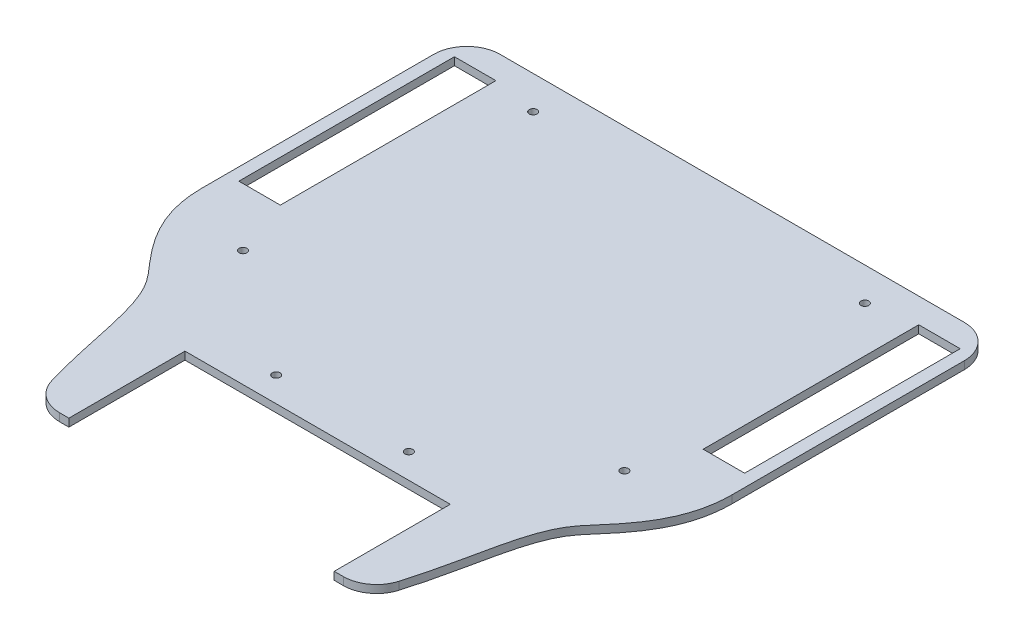
ISO-10303-21;
HEADER;
FILE_DESCRIPTION(('STEP AP214'),'2;1');
FILE_NAME('part.step','',(''),(''),'','','');
FILE_SCHEMA(('AUTOMOTIVE_DESIGN { 1 0 10303 214 1 1 1 1 }'));
ENDSEC;
DATA;
#1=APPLICATION_CONTEXT('core data for automotive mechanical design processes');
#2=APPLICATION_PROTOCOL_DEFINITION('international standard','automotive_design',2000,#1);
#3=PRODUCT_CONTEXT('',#1,'mechanical');
#4=PRODUCT('Part','Part','',(#3));
#5=PRODUCT_RELATED_PRODUCT_CATEGORY('part','',(#4));
#6=PRODUCT_DEFINITION_FORMATION('','',#4);
#7=PRODUCT_DEFINITION_CONTEXT('part definition',#1,'design');
#8=PRODUCT_DEFINITION('design','',#6,#7);
#9=PRODUCT_DEFINITION_SHAPE('','',#8);
#10=(LENGTH_UNIT() NAMED_UNIT(*) SI_UNIT(.MILLI.,.METRE.));
#11=(NAMED_UNIT(*) PLANE_ANGLE_UNIT() SI_UNIT($,.RADIAN.));
#12=(NAMED_UNIT(*) SI_UNIT($,.STERADIAN.) SOLID_ANGLE_UNIT());
#13=UNCERTAINTY_MEASURE_WITH_UNIT(LENGTH_MEASURE(1.E-05),#10,'distance_accuracy_value','');
#14=(GEOMETRIC_REPRESENTATION_CONTEXT(3) GLOBAL_UNCERTAINTY_ASSIGNED_CONTEXT((#13)) GLOBAL_UNIT_ASSIGNED_CONTEXT((#10,
#11,#12)) REPRESENTATION_CONTEXT('',''));
#15=CARTESIAN_POINT('',(0.,0.,0.));
#16=DIRECTION('',(0.,0.,1.));
#17=DIRECTION('',(1.,0.,0.));
#18=AXIS2_PLACEMENT_3D('',#15,#16,#17);
#19=CARTESIAN_POINT('',(-101.6,1.5,0.));
#20=CARTESIAN_POINT('',(-101.6,1.5,15.24));
#21=CARTESIAN_POINT('',(-92.8363642067102,1.5,28.2576559748796));
#22=CARTESIAN_POINT('',(-72.9170512750052,1.5,49.8798957879859));
#23=CARTESIAN_POINT('',(-72.6216772224956,1.5,76.5383978036396));
#24=CARTESIAN_POINT('',(-63.5,1.5,101.6));
#25=B_SPLINE_CURVE_WITH_KNOTS('',3,(#19,#20,#21,#22,#23,#24),.UNSPECIFIED.,.F.,.F.,(4,1,1,4),
(0.,0.41538000283183,0.51538000283183,1.),.UNSPECIFIED.);
#26=DIRECTION('',(0.,-1.,0.));
#27=VECTOR('',#26,1.);
#28=SURFACE_OF_LINEAR_EXTRUSION('',#25,#27);
#29=CARTESIAN_POINT('',(-101.6,-1.5,0.));
#30=CARTESIAN_POINT('',(-101.6,-1.5,15.24));
#31=CARTESIAN_POINT('',(-92.8363642067102,-1.5,28.2576559748796));
#32=CARTESIAN_POINT('',(-72.9170512750052,-1.5,49.8798957879859));
#33=CARTESIAN_POINT('',(-72.6216772224956,-1.5,76.5383978036396));
#34=CARTESIAN_POINT('',(-63.5,-1.5,101.6));
#35=B_SPLINE_CURVE_WITH_KNOTS('',3,(#29,#30,#31,#32,#33,#34),.UNSPECIFIED.,.F.,.F.,(4,1,1,4),
(0.,0.41538000283183,0.51538000283183,1.),.UNSPECIFIED.);
#36=CARTESIAN_POINT('',(-101.6,-1.5,0.));
#37=VERTEX_POINT('',#36);
#38=CARTESIAN_POINT('',(-66.4896873195006,-1.5,92.5138243337678));
#39=VERTEX_POINT('',#38);
#40=EDGE_CURVE('E228',#37,#39,#35,.T.);
#41=ORIENTED_EDGE('',*,*,#40,.T.);
#42=DIRECTION('',(0.,-1.,0.));
#43=VECTOR('',#42,1.);
#44=CARTESIAN_POINT('',(-66.4896873195006,-1.5,92.5138243337678));
#45=LINE('',#44,#43);
#46=CARTESIAN_POINT('',(-66.4896873195006,1.5,92.5138243337678));
#47=VERTEX_POINT('',#46);
#48=EDGE_CURVE('E349',#39,#47,#45,.F.);
#49=ORIENTED_EDGE('',*,*,#48,.T.);
#50=CARTESIAN_POINT('',(-101.6,1.5,0.));
#51=VERTEX_POINT('',#50);
#52=EDGE_CURVE('E299',#51,#47,#25,.T.);
#53=ORIENTED_EDGE('',*,*,#52,.F.);
#54=DIRECTION('',(0.,-1.,0.));
#55=VECTOR('',#54,1.);
#56=CARTESIAN_POINT('',(-101.6,1.5,0.));
#57=LINE('',#56,#55);
#58=EDGE_CURVE('E444',#51,#37,#57,.T.);
#59=ORIENTED_EDGE('',*,*,#58,.T.);
#60=EDGE_LOOP('',(#41,#49,#53,#59));
#61=FACE_BOUND('',#60,.T.);
#62=ADVANCED_FACE('F37',(#61),#28,.F.);
#63=CARTESIAN_POINT('',(-63.5,1.5,101.6));
#64=DIRECTION('',(0.,0.,-1.));
#65=DIRECTION('',(-1.,0.,0.));
#66=AXIS2_PLACEMENT_3D('',#63,#64,#65);
#67=PLANE('',#66);
#68=DIRECTION('',(1.,0.,0.));
#69=VECTOR('',#68,1.);
#70=CARTESIAN_POINT('',(-63.5,1.5,101.6));
#71=LINE('',#70,#69);
#72=CARTESIAN_POINT('',(-54.3147017472436,1.5,101.6));
#73=VERTEX_POINT('',#72);
#74=CARTESIAN_POINT('',(-50.8,1.5,101.6));
#75=VERTEX_POINT('',#74);
#76=EDGE_CURVE('E305',#73,#75,#71,.T.);
#77=ORIENTED_EDGE('',*,*,#76,.F.);
#78=DIRECTION('',(0.,-1.,0.));
#79=VECTOR('',#78,1.);
#80=CARTESIAN_POINT('',(-54.3147017472436,1.5,101.6));
#81=LINE('',#80,#79);
#82=CARTESIAN_POINT('',(-54.3147017472436,-1.5,101.6));
#83=VERTEX_POINT('',#82);
#84=EDGE_CURVE('E346',#73,#83,#81,.T.);
#85=ORIENTED_EDGE('',*,*,#84,.T.);
#86=DIRECTION('',(1.,0.,0.));
#87=VECTOR('',#86,1.);
#88=CARTESIAN_POINT('',(-63.5,-1.5,101.6));
#89=LINE('',#88,#87);
#90=CARTESIAN_POINT('',(-50.8,-1.5,101.6));
#91=VERTEX_POINT('',#90);
#92=EDGE_CURVE('E417',#83,#91,#89,.T.);
#93=ORIENTED_EDGE('',*,*,#92,.T.);
#94=DIRECTION('',(0.,-1.,0.));
#95=VECTOR('',#94,1.);
#96=CARTESIAN_POINT('',(-50.8,1.5,101.6));
#97=LINE('',#96,#95);
#98=EDGE_CURVE('E412',#75,#91,#97,.T.);
#99=ORIENTED_EDGE('',*,*,#98,.F.);
#100=EDGE_LOOP('',(#77,#85,#93,#99));
#101=FACE_BOUND('',#100,.T.);
#102=ADVANCED_FACE('F315',(#101),#67,.F.);
#103=CARTESIAN_POINT('',(-50.8,1.5,101.6));
#104=DIRECTION('',(-1.,0.,0.));
#105=DIRECTION('',(0.,0.,1.));
#106=AXIS2_PLACEMENT_3D('',#103,#104,#105);
#107=PLANE('',#106);
#108=DIRECTION('',(0.,0.,-1.));
#109=VECTOR('',#108,1.);
#110=CARTESIAN_POINT('',(-50.8,-1.5,101.6));
#111=LINE('',#110,#109);
#112=CARTESIAN_POINT('',(-50.8,-1.5,57.15));
#113=VERTEX_POINT('',#112);
#114=EDGE_CURVE('E406',#91,#113,#111,.T.);
#115=ORIENTED_EDGE('',*,*,#114,.T.);
#116=DIRECTION('',(0.,-1.,0.));
#117=VECTOR('',#116,1.);
#118=CARTESIAN_POINT('',(-50.8,1.5,57.15));
#119=LINE('',#118,#117);
#120=CARTESIAN_POINT('',(-50.8,1.5,57.15));
#121=VERTEX_POINT('',#120);
#122=EDGE_CURVE('E409',#121,#113,#119,.T.);
#123=ORIENTED_EDGE('',*,*,#122,.F.);
#124=DIRECTION('',(0.,0.,-1.));
#125=VECTOR('',#124,1.);
#126=CARTESIAN_POINT('',(-50.8,1.5,101.6));
#127=LINE('',#126,#125);
#128=EDGE_CURVE('E496',#75,#121,#127,.T.);
#129=ORIENTED_EDGE('',*,*,#128,.F.);
#130=ORIENTED_EDGE('',*,*,#98,.T.);
#131=EDGE_LOOP('',(#115,#123,#129,#130));
#132=FACE_BOUND('',#131,.T.);
#133=ADVANCED_FACE('F395',(#132),#107,.F.);
#134=CARTESIAN_POINT('',(-50.8,1.5,57.15));
#135=DIRECTION('',(0.,0.,-1.));
#136=DIRECTION('',(-1.,0.,0.));
#137=AXIS2_PLACEMENT_3D('',#134,#135,#136);
#138=PLANE('',#137);
#139=DIRECTION('',(1.,0.,0.));
#140=VECTOR('',#139,1.);
#141=CARTESIAN_POINT('',(-50.8,-1.5,57.15));
#142=LINE('',#141,#140);
#143=CARTESIAN_POINT('',(50.8,-1.5,57.15));
#144=VERTEX_POINT('',#143);
#145=EDGE_CURVE('E416',#113,#144,#142,.T.);
#146=ORIENTED_EDGE('',*,*,#145,.T.);
#147=DIRECTION('',(0.,-1.,0.));
#148=VECTOR('',#147,1.);
#149=CARTESIAN_POINT('',(50.8,1.5,57.15));
#150=LINE('',#149,#148);
#151=CARTESIAN_POINT('',(50.8,1.5,57.15));
#152=VERTEX_POINT('',#151);
#153=EDGE_CURVE('E421',#152,#144,#150,.T.);
#154=ORIENTED_EDGE('',*,*,#153,.F.);
#155=DIRECTION('',(1.,0.,0.));
#156=VECTOR('',#155,1.);
#157=CARTESIAN_POINT('',(-50.8,1.5,57.15));
#158=LINE('',#157,#156);
#159=EDGE_CURVE('E368',#121,#152,#158,.T.);
#160=ORIENTED_EDGE('',*,*,#159,.F.);
#161=ORIENTED_EDGE('',*,*,#122,.T.);
#162=EDGE_LOOP('',(#146,#154,#160,#161));
#163=FACE_BOUND('',#162,.T.);
#164=ADVANCED_FACE('F392',(#163),#138,.F.);
#165=CARTESIAN_POINT('',(50.8,1.5,57.15));
#166=DIRECTION('',(1.,0.,0.));
#167=DIRECTION('',(0.,0.,-1.));
#168=AXIS2_PLACEMENT_3D('',#165,#166,#167);
#169=PLANE('',#168);
#170=DIRECTION('',(0.,0.,1.));
#171=VECTOR('',#170,1.);
#172=CARTESIAN_POINT('',(50.8,-1.5,57.15));
#173=LINE('',#172,#171);
#174=CARTESIAN_POINT('',(50.8,-1.5,101.6));
#175=VERTEX_POINT('',#174);
#176=EDGE_CURVE('E425',#144,#175,#173,.T.);
#177=ORIENTED_EDGE('',*,*,#176,.T.);
#178=DIRECTION('',(0.,-1.,0.));
#179=VECTOR('',#178,1.);
#180=CARTESIAN_POINT('',(50.8,1.5,101.6));
#181=LINE('',#180,#179);
#182=CARTESIAN_POINT('',(50.8,1.5,101.6));
#183=VERTEX_POINT('',#182);
#184=EDGE_CURVE('E451',#183,#175,#181,.T.);
#185=ORIENTED_EDGE('',*,*,#184,.F.);
#186=DIRECTION('',(0.,0.,1.));
#187=VECTOR('',#186,1.);
#188=CARTESIAN_POINT('',(50.8,1.5,57.15));
#189=LINE('',#188,#187);
#190=EDGE_CURVE('E362',#152,#183,#189,.T.);
#191=ORIENTED_EDGE('',*,*,#190,.F.);
#192=ORIENTED_EDGE('',*,*,#153,.T.);
#193=EDGE_LOOP('',(#177,#185,#191,#192));
#194=FACE_BOUND('',#193,.T.);
#195=ADVANCED_FACE('F389',(#194),#169,.F.);
#196=CARTESIAN_POINT('',(50.8,1.5,101.6));
#197=DIRECTION('',(0.,0.,-1.));
#198=DIRECTION('',(-1.,0.,0.));
#199=AXIS2_PLACEMENT_3D('',#196,#197,#198);
#200=PLANE('',#199);
#201=DIRECTION('',(1.,0.,0.));
#202=VECTOR('',#201,1.);
#203=CARTESIAN_POINT('',(50.8,-1.5,101.6));
#204=LINE('',#203,#202);
#205=CARTESIAN_POINT('',(54.3147017472436,-1.5,101.6));
#206=VERTEX_POINT('',#205);
#207=EDGE_CURVE('E358',#175,#206,#204,.T.);
#208=ORIENTED_EDGE('',*,*,#207,.T.);
#209=DIRECTION('',(0.,-1.,0.));
#210=VECTOR('',#209,1.);
#211=CARTESIAN_POINT('',(54.3147017472436,1.5,101.6));
#212=LINE('',#211,#210);
#213=CARTESIAN_POINT('',(54.3147017472436,1.5,101.6));
#214=VERTEX_POINT('',#213);
#215=EDGE_CURVE('E45',#206,#214,#212,.F.);
#216=ORIENTED_EDGE('',*,*,#215,.T.);
#217=DIRECTION('',(1.,0.,0.));
#218=VECTOR('',#217,1.);
#219=CARTESIAN_POINT('',(50.8,1.5,101.6));
#220=LINE('',#219,#218);
#221=EDGE_CURVE('E356',#183,#214,#220,.T.);
#222=ORIENTED_EDGE('',*,*,#221,.F.);
#223=ORIENTED_EDGE('',*,*,#184,.T.);
#224=EDGE_LOOP('',(#208,#216,#222,#223));
#225=FACE_BOUND('',#224,.T.);
#226=ADVANCED_FACE('F354',(#225),#200,.F.);
#227=CARTESIAN_POINT('',(63.5,1.5,101.6));
#228=CARTESIAN_POINT('',(72.6216772224956,1.5,76.5383978036396));
#229=CARTESIAN_POINT('',(72.9170512750052,1.5,49.8798957879859));
#230=CARTESIAN_POINT('',(92.8363642067102,1.5,28.2576559748795));
#231=CARTESIAN_POINT('',(101.6,1.5,15.24));
#232=CARTESIAN_POINT('',(101.6,1.5,0.));
#233=B_SPLINE_CURVE_WITH_KNOTS('',3,(#227,#228,#229,#230,#231,#232),.UNSPECIFIED.,.F.,.F.,(4,1,
1,4),(0.,0.48461999716817,0.58461999716817,1.),.UNSPECIFIED.);
#234=DIRECTION('',(0.,-1.,0.));
#235=VECTOR('',#234,1.);
#236=SURFACE_OF_LINEAR_EXTRUSION('',#233,#235);
#237=CARTESIAN_POINT('',(66.4896873195006,1.5,92.5138243337678));
#238=VERTEX_POINT('',#237);
#239=CARTESIAN_POINT('',(101.6,1.5,0.));
#240=VERTEX_POINT('',#239);
#241=EDGE_CURVE('E364',#238,#240,#233,.T.);
#242=ORIENTED_EDGE('',*,*,#241,.F.);
#243=DIRECTION('',(0.,-1.,0.));
#244=VECTOR('',#243,1.);
#245=CARTESIAN_POINT('',(66.4896873195006,1.5,92.5138243337678));
#246=LINE('',#245,#244);
#247=CARTESIAN_POINT('',(66.4896873195006,-1.5,92.5138243337678));
#248=VERTEX_POINT('',#247);
#249=EDGE_CURVE('E335',#238,#248,#246,.T.);
#250=ORIENTED_EDGE('',*,*,#249,.T.);
#251=CARTESIAN_POINT('',(63.5,-1.5,101.6));
#252=CARTESIAN_POINT('',(72.6216772224956,-1.5,76.5383978036396));
#253=CARTESIAN_POINT('',(72.9170512750052,-1.5,49.8798957879859));
#254=CARTESIAN_POINT('',(92.8363642067102,-1.5,28.2576559748795));
#255=CARTESIAN_POINT('',(101.6,-1.5,15.24));
#256=CARTESIAN_POINT('',(101.6,-1.5,0.));
#257=B_SPLINE_CURVE_WITH_KNOTS('',3,(#251,#252,#253,#254,#255,#256),.UNSPECIFIED.,.F.,.F.,(4,1,
1,4),(0.,0.48461999716817,0.58461999716817,1.),.UNSPECIFIED.);
#258=CARTESIAN_POINT('',(101.6,-1.5,0.));
#259=VERTEX_POINT('',#258);
#260=EDGE_CURVE('E431',#248,#259,#257,.T.);
#261=ORIENTED_EDGE('',*,*,#260,.T.);
#262=DIRECTION('',(0.,-1.,0.));
#263=VECTOR('',#262,1.);
#264=CARTESIAN_POINT('',(101.6,1.5,0.));
#265=LINE('',#264,#263);
#266=EDGE_CURVE('E447',#240,#259,#265,.T.);
#267=ORIENTED_EDGE('',*,*,#266,.F.);
#268=EDGE_LOOP('',(#242,#250,#261,#267));
#269=FACE_BOUND('',#268,.T.);
#270=ADVANCED_FACE('F380',(#269),#236,.F.);
#271=CARTESIAN_POINT('',(101.6,1.5,-101.6));
#272=DIRECTION('',(-1.,0.,0.));
#273=DIRECTION('',(0.,0.,1.));
#274=AXIS2_PLACEMENT_3D('',#271,#272,#273);
#275=PLANE('',#274);
#276=DIRECTION('',(0.,0.,-1.));
#277=VECTOR('',#276,1.);
#278=CARTESIAN_POINT('',(101.6,-1.5,-101.6));
#279=LINE('',#278,#277);
#280=CARTESIAN_POINT('',(101.6,-1.5,-88.9));
#281=VERTEX_POINT('',#280);
#282=EDGE_CURVE('E435',#259,#281,#279,.T.);
#283=ORIENTED_EDGE('',*,*,#282,.T.);
#284=DIRECTION('',(0.,-1.,0.));
#285=VECTOR('',#284,1.);
#286=CARTESIAN_POINT('',(101.6,1.5,-88.9));
#287=LINE('',#286,#285);
#288=CARTESIAN_POINT('',(101.6,1.5,-88.9));
#289=VERTEX_POINT('',#288);
#290=EDGE_CURVE('E11',#281,#289,#287,.F.);
#291=ORIENTED_EDGE('',*,*,#290,.T.);
#292=DIRECTION('',(0.,0.,-1.));
#293=VECTOR('',#292,1.);
#294=CARTESIAN_POINT('',(101.6,1.5,-101.6));
#295=LINE('',#294,#293);
#296=EDGE_CURVE('E366',#240,#289,#295,.T.);
#297=ORIENTED_EDGE('',*,*,#296,.F.);
#298=ORIENTED_EDGE('',*,*,#266,.T.);
#299=EDGE_LOOP('',(#283,#291,#297,#298));
#300=FACE_BOUND('',#299,.T.);
#301=ADVANCED_FACE('F384',(#300),#275,.F.);
#302=CARTESIAN_POINT('',(-101.6,1.5,-101.6));
#303=DIRECTION('',(0.,0.,1.));
#304=DIRECTION('',(1.,0.,0.));
#305=AXIS2_PLACEMENT_3D('',#302,#303,#304);
#306=PLANE('',#305);
#307=DIRECTION('',(-1.,0.,0.));
#308=VECTOR('',#307,1.);
#309=CARTESIAN_POINT('',(-101.6,-1.5,-101.6));
#310=LINE('',#309,#308);
#311=CARTESIAN_POINT('',(88.9,-1.5,-101.6));
#312=VERTEX_POINT('',#311);
#313=CARTESIAN_POINT('',(-88.9,-1.5,-101.6));
#314=VERTEX_POINT('',#313);
#315=EDGE_CURVE('E440',#312,#314,#310,.T.);
#316=ORIENTED_EDGE('',*,*,#315,.T.);
#317=DIRECTION('',(0.,-1.,0.));
#318=VECTOR('',#317,1.);
#319=CARTESIAN_POINT('',(-88.9,1.5,-101.6));
#320=LINE('',#319,#318);
#321=CARTESIAN_POINT('',(-88.9,1.5,-101.6));
#322=VERTEX_POINT('',#321);
#323=EDGE_CURVE('E341',#314,#322,#320,.F.);
#324=ORIENTED_EDGE('',*,*,#323,.T.);
#325=DIRECTION('',(-1.,0.,0.));
#326=VECTOR('',#325,1.);
#327=CARTESIAN_POINT('',(-101.6,1.5,-101.6));
#328=LINE('',#327,#326);
#329=CARTESIAN_POINT('',(88.9,1.5,-101.6));
#330=VERTEX_POINT('',#329);
#331=EDGE_CURVE('E472',#330,#322,#328,.T.);
#332=ORIENTED_EDGE('',*,*,#331,.F.);
#333=DIRECTION('',(0.,-1.,0.));
#334=VECTOR('',#333,1.);
#335=CARTESIAN_POINT('',(88.9,1.5,-101.6));
#336=LINE('',#335,#334);
#337=EDGE_CURVE('E466',#330,#312,#336,.T.);
#338=ORIENTED_EDGE('',*,*,#337,.T.);
#339=EDGE_LOOP('',(#316,#324,#332,#338));
#340=FACE_BOUND('',#339,.T.);
#341=ADVANCED_FACE('F471',(#340),#306,.F.);
#342=CARTESIAN_POINT('',(-101.6,1.5,0.));
#343=DIRECTION('',(1.,0.,0.));
#344=DIRECTION('',(0.,0.,-1.));
#345=AXIS2_PLACEMENT_3D('',#342,#343,#344);
#346=PLANE('',#345);
#347=DIRECTION('',(0.,0.,1.));
#348=VECTOR('',#347,1.);
#349=CARTESIAN_POINT('',(-101.6,1.5,0.));
#350=LINE('',#349,#348);
#351=CARTESIAN_POINT('',(-101.6,1.5,-88.9));
#352=VERTEX_POINT('',#351);
#353=EDGE_CURVE('E448',#352,#51,#350,.T.);
#354=ORIENTED_EDGE('',*,*,#353,.F.);
#355=DIRECTION('',(0.,-1.,0.));
#356=VECTOR('',#355,1.);
#357=CARTESIAN_POINT('',(-101.6,1.5,-88.9));
#358=LINE('',#357,#356);
#359=CARTESIAN_POINT('',(-101.6,-1.5,-88.9));
#360=VERTEX_POINT('',#359);
#361=EDGE_CURVE('E455',#352,#360,#358,.T.);
#362=ORIENTED_EDGE('',*,*,#361,.T.);
#363=DIRECTION('',(0.,0.,1.));
#364=VECTOR('',#363,1.);
#365=CARTESIAN_POINT('',(-101.6,-1.5,0.));
#366=LINE('',#365,#364);
#367=EDGE_CURVE('E306',#360,#37,#366,.T.);
#368=ORIENTED_EDGE('',*,*,#367,.T.);
#369=ORIENTED_EDGE('',*,*,#58,.F.);
#370=EDGE_LOOP('',(#354,#362,#368,#369));
#371=FACE_BOUND('',#370,.T.);
#372=ADVANCED_FACE('F480',(#371),#346,.F.);
#373=CARTESIAN_POINT('',(-81.698504606822,1.5,40.8141557362524));
#374=DIRECTION('',(0.,-1.,0.));
#375=DIRECTION('',(0.,0.,-1.));
#376=AXIS2_PLACEMENT_3D('',#373,#374,#375);
#377=PLANE('',#376);
#378=DIRECTION('',(-1.,0.,0.));
#379=VECTOR('',#378,1.);
#380=CARTESIAN_POINT('',(-96.8375,1.5,-92.075));
#381=LINE('',#380,#379);
#382=CARTESIAN_POINT('',(-80.9625,1.5,-92.075));
#383=VERTEX_POINT('',#382);
#384=CARTESIAN_POINT('',(-96.8375,1.5,-92.075));
#385=VERTEX_POINT('',#384);
#386=EDGE_CURVE('E221',#383,#385,#381,.T.);
#387=ORIENTED_EDGE('',*,*,#386,.F.);
#388=DIRECTION('',(0.,0.,-1.));
#389=VECTOR('',#388,1.);
#390=CARTESIAN_POINT('',(-80.9625,1.5,-9.52499999999998));
#391=LINE('',#390,#389);
#392=CARTESIAN_POINT('',(-80.9625,1.5,-9.52499999999998));
#393=VERTEX_POINT('',#392);
#394=EDGE_CURVE('E194',#393,#383,#391,.T.);
#395=ORIENTED_EDGE('',*,*,#394,.F.);
#396=DIRECTION('',(1.,0.,0.));
#397=VECTOR('',#396,1.);
#398=CARTESIAN_POINT('',(-96.8375,1.5,-9.52499999999998));
#399=LINE('',#398,#397);
#400=CARTESIAN_POINT('',(-96.8375,1.5,-9.52499999999998));
#401=VERTEX_POINT('',#400);
#402=EDGE_CURVE('E212',#401,#393,#399,.T.);
#403=ORIENTED_EDGE('',*,*,#402,.F.);
#404=DIRECTION('',(0.,0.,1.));
#405=VECTOR('',#404,1.);
#406=CARTESIAN_POINT('',(-96.8375,1.5,-9.52499999999998));
#407=LINE('',#406,#405);
#408=EDGE_CURVE('E215',#385,#401,#407,.T.);
#409=ORIENTED_EDGE('',*,*,#408,.F.);
#410=EDGE_LOOP('',(#387,#395,#403,#409));
#411=FACE_BOUND('',#410,.T.);
#412=CARTESIAN_POINT('',(-63.4999999993105,1.5,-88.8999999999953));
#413=DIRECTION('',(0.,1.,0.));
#414=DIRECTION('',(0.,0.,1.));
#415=AXIS2_PLACEMENT_3D('',#412,#413,#414);
#416=CIRCLE('',#415,1.5);
#417=CARTESIAN_POINT('',(-63.4999999993105,1.5,-87.3999999999953));
#418=VERTEX_POINT('',#417);
#419=EDGE_CURVE('E234',#418,#418,#416,.T.);
#420=ORIENTED_EDGE('',*,*,#419,.F.);
#421=EDGE_LOOP('',(#420));
#422=FACE_BOUND('',#421,.T.);
#423=CARTESIAN_POINT('',(-73.0249999993105,1.5,12.7));
#424=DIRECTION('',(0.,1.,0.));
#425=DIRECTION('',(0.,0.,1.));
#426=AXIS2_PLACEMENT_3D('',#423,#424,#425);
#427=CIRCLE('',#426,1.5);
#428=CARTESIAN_POINT('',(-73.0249999993105,1.5,14.2));
#429=VERTEX_POINT('',#428);
#430=EDGE_CURVE('E240',#429,#429,#427,.T.);
#431=ORIENTED_EDGE('',*,*,#430,.F.);
#432=EDGE_LOOP('',(#431));
#433=FACE_BOUND('',#432,.T.);
#434=CARTESIAN_POINT('',(-25.3999999993105,1.5,47.625));
#435=DIRECTION('',(0.,1.,0.));
#436=DIRECTION('',(0.,0.,1.));
#437=AXIS2_PLACEMENT_3D('',#434,#435,#436);
#438=CIRCLE('',#437,1.5);
#439=CARTESIAN_POINT('',(-25.3999999993105,1.5,49.125));
#440=VERTEX_POINT('',#439);
#441=EDGE_CURVE('E246',#440,#440,#438,.T.);
#442=ORIENTED_EDGE('',*,*,#441,.F.);
#443=EDGE_LOOP('',(#442));
#444=FACE_BOUND('',#443,.T.);
#445=CARTESIAN_POINT('',(25.3999999993108,1.5,47.6249999999998));
#446=DIRECTION('',(0.,1.,0.));
#447=DIRECTION('',(0.,0.,-1.));
#448=AXIS2_PLACEMENT_3D('',#445,#446,#447);
#449=CIRCLE('',#448,1.5);
#450=CARTESIAN_POINT('',(25.3999999993108,1.5,46.1249999999998));
#451=VERTEX_POINT('',#450);
#452=EDGE_CURVE('E252',#451,#451,#449,.T.);
#453=ORIENTED_EDGE('',*,*,#452,.F.);
#454=EDGE_LOOP('',(#453));
#455=FACE_BOUND('',#454,.T.);
#456=CARTESIAN_POINT('',(73.0249999993106,1.5,12.6999999999996));
#457=DIRECTION('',(0.,1.,0.));
#458=DIRECTION('',(0.,0.,-1.));
#459=AXIS2_PLACEMENT_3D('',#456,#457,#458);
#460=CIRCLE('',#459,1.5);
#461=CARTESIAN_POINT('',(73.0249999993106,1.5,11.1999999999996));
#462=VERTEX_POINT('',#461);
#463=EDGE_CURVE('E258',#462,#462,#460,.T.);
#464=ORIENTED_EDGE('',*,*,#463,.F.);
#465=EDGE_LOOP('',(#464));
#466=FACE_BOUND('',#465,.T.);
#467=CARTESIAN_POINT('',(63.4999999993099,1.5,-88.8999999999958));
#468=DIRECTION('',(0.,1.,0.));
#469=DIRECTION('',(0.,0.,-1.));
#470=AXIS2_PLACEMENT_3D('',#467,#468,#469);
#471=CIRCLE('',#470,1.50000000000002);
#472=CARTESIAN_POINT('',(63.4999999993099,1.5,-90.3999999999958));
#473=VERTEX_POINT('',#472);
#474=EDGE_CURVE('E264',#473,#473,#471,.T.);
#475=ORIENTED_EDGE('',*,*,#474,.F.);
#476=EDGE_LOOP('',(#475));
#477=FACE_BOUND('',#476,.T.);
#478=DIRECTION('',(-1.,0.,0.));
#479=VECTOR('',#478,1.);
#480=CARTESIAN_POINT('',(96.8374999999993,1.5,-92.0750000000004));
#481=LINE('',#480,#479);
#482=CARTESIAN_POINT('',(96.8374999999993,1.5,-92.0750000000004));
#483=VERTEX_POINT('',#482);
#484=CARTESIAN_POINT('',(80.9624999999993,1.5,-92.0750000000004));
#485=VERTEX_POINT('',#484);
#486=EDGE_CURVE('E284',#483,#485,#481,.T.);
#487=ORIENTED_EDGE('',*,*,#486,.F.);
#488=DIRECTION('',(0.,0.,-1.));
#489=VECTOR('',#488,1.);
#490=CARTESIAN_POINT('',(96.8374999999999,1.5,-9.52500000000042));
#491=LINE('',#490,#489);
#492=CARTESIAN_POINT('',(96.8374999999999,1.5,-9.52500000000042));
#493=VERTEX_POINT('',#492);
#494=EDGE_CURVE('E282',#493,#483,#491,.T.);
#495=ORIENTED_EDGE('',*,*,#494,.F.);
#496=DIRECTION('',(1.,0.,0.));
#497=VECTOR('',#496,1.);
#498=CARTESIAN_POINT('',(96.8374999999999,1.5,-9.52500000000042));
#499=LINE('',#498,#497);
#500=CARTESIAN_POINT('',(80.9624999999999,1.5,-9.52500000000042));
#501=VERTEX_POINT('',#500);
#502=EDGE_CURVE('E272',#501,#493,#499,.T.);
#503=ORIENTED_EDGE('',*,*,#502,.F.);
#504=DIRECTION('',(0.,0.,1.));
#505=VECTOR('',#504,1.);
#506=CARTESIAN_POINT('',(80.9624999999999,1.5,-9.52500000000042));
#507=LINE('',#506,#505);
#508=EDGE_CURVE('E287',#485,#501,#507,.T.);
#509=ORIENTED_EDGE('',*,*,#508,.F.);
#510=EDGE_LOOP('',(#487,#495,#503,#509));
#511=FACE_BOUND('',#510,.T.);
#512=ORIENTED_EDGE('',*,*,#331,.T.);
#513=CARTESIAN_POINT('',(-88.9,1.5,-88.9));
#514=DIRECTION('',(0.,-1.,0.));
#515=DIRECTION('',(0.,0.,-1.));
#516=AXIS2_PLACEMENT_3D('',#513,#514,#515);
#517=CIRCLE('',#516,12.7);
#518=EDGE_CURVE('E339',#322,#352,#517,.F.);
#519=ORIENTED_EDGE('',*,*,#518,.T.);
#520=ORIENTED_EDGE('',*,*,#353,.T.);
#521=ORIENTED_EDGE('',*,*,#52,.T.);
#522=CARTESIAN_POINT('',(-54.3147017472436,1.5,88.9));
#523=DIRECTION('',(0.,-1.,0.));
#524=DIRECTION('',(0.,0.,-1.));
#525=AXIS2_PLACEMENT_3D('',#522,#523,#524);
#526=CIRCLE('',#525,12.7);
#527=EDGE_CURVE('E336',#47,#73,#526,.F.);
#528=ORIENTED_EDGE('',*,*,#527,.T.);
#529=ORIENTED_EDGE('',*,*,#76,.T.);
#530=ORIENTED_EDGE('',*,*,#128,.T.);
#531=ORIENTED_EDGE('',*,*,#159,.T.);
#532=ORIENTED_EDGE('',*,*,#190,.T.);
#533=ORIENTED_EDGE('',*,*,#221,.T.);
#534=CARTESIAN_POINT('',(54.3147017472436,1.5,88.9));
#535=DIRECTION('',(0.,-1.,0.));
#536=DIRECTION('',(0.,0.,-1.));
#537=AXIS2_PLACEMENT_3D('',#534,#535,#536);
#538=CIRCLE('',#537,12.7);
#539=EDGE_CURVE('E58',#214,#238,#538,.F.);
#540=ORIENTED_EDGE('',*,*,#539,.T.);
#541=ORIENTED_EDGE('',*,*,#241,.T.);
#542=ORIENTED_EDGE('',*,*,#296,.T.);
#543=CARTESIAN_POINT('',(88.9,1.5,-88.9));
#544=DIRECTION('',(0.,-1.,0.));
#545=DIRECTION('',(0.,0.,-1.));
#546=AXIS2_PLACEMENT_3D('',#543,#544,#545);
#547=CIRCLE('',#546,12.7);
#548=EDGE_CURVE('E337',#289,#330,#547,.F.);
#549=ORIENTED_EDGE('',*,*,#548,.T.);
#550=EDGE_LOOP('',(#512,#519,#520,#521,#528,#529,#530,#531,#532,#533,#540,#541,#542,#549));
#551=FACE_BOUND('',#550,.T.);
#552=ADVANCED_FACE('F360',(#411,#422,#433,#444,#455,#466,#477,#511,#551),#377,.F.);
#553=CARTESIAN_POINT('',(-81.698504606822,-1.5,40.8141557362524));
#554=DIRECTION('',(0.,-1.,0.));
#555=DIRECTION('',(0.,0.,-1.));
#556=AXIS2_PLACEMENT_3D('',#553,#554,#555);
#557=PLANE('',#556);
#558=DIRECTION('',(0.,0.,-1.));
#559=VECTOR('',#558,1.);
#560=CARTESIAN_POINT('',(-80.9625,-1.5,-9.52499999999998));
#561=LINE('',#560,#559);
#562=CARTESIAN_POINT('',(-80.9625,-1.5,-9.52499999999998));
#563=VERTEX_POINT('',#562);
#564=CARTESIAN_POINT('',(-80.9625,-1.5,-92.075));
#565=VERTEX_POINT('',#564);
#566=EDGE_CURVE('E191',#563,#565,#561,.T.);
#567=ORIENTED_EDGE('',*,*,#566,.T.);
#568=DIRECTION('',(-1.,0.,0.));
#569=VECTOR('',#568,1.);
#570=CARTESIAN_POINT('',(-96.8375,-1.5,-92.075));
#571=LINE('',#570,#569);
#572=CARTESIAN_POINT('',(-96.8375,-1.5,-92.075));
#573=VERTEX_POINT('',#572);
#574=EDGE_CURVE('E203',#565,#573,#571,.T.);
#575=ORIENTED_EDGE('',*,*,#574,.T.);
#576=DIRECTION('',(0.,0.,1.));
#577=VECTOR('',#576,1.);
#578=CARTESIAN_POINT('',(-96.8375,-1.5,-9.52499999999998));
#579=LINE('',#578,#577);
#580=CARTESIAN_POINT('',(-96.8375,-1.5,-9.52499999999998));
#581=VERTEX_POINT('',#580);
#582=EDGE_CURVE('E207',#573,#581,#579,.T.);
#583=ORIENTED_EDGE('',*,*,#582,.T.);
#584=DIRECTION('',(1.,0.,0.));
#585=VECTOR('',#584,1.);
#586=CARTESIAN_POINT('',(-96.8375,-1.5,-9.52499999999998));
#587=LINE('',#586,#585);
#588=EDGE_CURVE('E199',#581,#563,#587,.T.);
#589=ORIENTED_EDGE('',*,*,#588,.T.);
#590=EDGE_LOOP('',(#567,#575,#583,#589));
#591=FACE_BOUND('',#590,.T.);
#592=CARTESIAN_POINT('',(-63.4999999993105,-1.5,-88.8999999999953));
#593=DIRECTION('',(0.,1.,0.));
#594=DIRECTION('',(0.,0.,1.));
#595=AXIS2_PLACEMENT_3D('',#592,#593,#594);
#596=CIRCLE('',#595,1.5);
#597=CARTESIAN_POINT('',(-63.4999999993105,-1.5,-87.3999999999953));
#598=VERTEX_POINT('',#597);
#599=EDGE_CURVE('E222',#598,#598,#596,.T.);
#600=ORIENTED_EDGE('',*,*,#599,.T.);
#601=EDGE_LOOP('',(#600));
#602=FACE_BOUND('',#601,.T.);
#603=CARTESIAN_POINT('',(-73.0249999993105,-1.5,12.7));
#604=DIRECTION('',(0.,1.,0.));
#605=DIRECTION('',(0.,0.,1.));
#606=AXIS2_PLACEMENT_3D('',#603,#604,#605);
#607=CIRCLE('',#606,1.5);
#608=CARTESIAN_POINT('',(-73.0249999993105,-1.5,14.2));
#609=VERTEX_POINT('',#608);
#610=EDGE_CURVE('E237',#609,#609,#607,.T.);
#611=ORIENTED_EDGE('',*,*,#610,.T.);
#612=EDGE_LOOP('',(#611));
#613=FACE_BOUND('',#612,.T.);
#614=CARTESIAN_POINT('',(-25.3999999993105,-1.5,47.625));
#615=DIRECTION('',(0.,1.,0.));
#616=DIRECTION('',(0.,0.,1.));
#617=AXIS2_PLACEMENT_3D('',#614,#615,#616);
#618=CIRCLE('',#617,1.5);
#619=CARTESIAN_POINT('',(-25.3999999993105,-1.5,49.125));
#620=VERTEX_POINT('',#619);
#621=EDGE_CURVE('E243',#620,#620,#618,.T.);
#622=ORIENTED_EDGE('',*,*,#621,.T.);
#623=EDGE_LOOP('',(#622));
#624=FACE_BOUND('',#623,.T.);
#625=CARTESIAN_POINT('',(25.3999999993108,-1.5,47.6249999999998));
#626=DIRECTION('',(0.,1.,0.));
#627=DIRECTION('',(0.,0.,-1.));
#628=AXIS2_PLACEMENT_3D('',#625,#626,#627);
#629=CIRCLE('',#628,1.5);
#630=CARTESIAN_POINT('',(25.3999999993108,-1.5,46.1249999999998));
#631=VERTEX_POINT('',#630);
#632=EDGE_CURVE('E249',#631,#631,#629,.T.);
#633=ORIENTED_EDGE('',*,*,#632,.T.);
#634=EDGE_LOOP('',(#633));
#635=FACE_BOUND('',#634,.T.);
#636=CARTESIAN_POINT('',(73.0249999993106,-1.5,12.6999999999996));
#637=DIRECTION('',(0.,1.,0.));
#638=DIRECTION('',(0.,0.,-1.));
#639=AXIS2_PLACEMENT_3D('',#636,#637,#638);
#640=CIRCLE('',#639,1.5);
#641=CARTESIAN_POINT('',(73.0249999993106,-1.5,11.1999999999996));
#642=VERTEX_POINT('',#641);
#643=EDGE_CURVE('E255',#642,#642,#640,.T.);
#644=ORIENTED_EDGE('',*,*,#643,.T.);
#645=EDGE_LOOP('',(#644));
#646=FACE_BOUND('',#645,.T.);
#647=CARTESIAN_POINT('',(63.4999999993099,-1.5,-88.8999999999958));
#648=DIRECTION('',(0.,1.,0.));
#649=DIRECTION('',(0.,0.,-1.));
#650=AXIS2_PLACEMENT_3D('',#647,#648,#649);
#651=CIRCLE('',#650,1.50000000000002);
#652=CARTESIAN_POINT('',(63.4999999993099,-1.5,-90.3999999999958));
#653=VERTEX_POINT('',#652);
#654=EDGE_CURVE('E261',#653,#653,#651,.T.);
#655=ORIENTED_EDGE('',*,*,#654,.T.);
#656=EDGE_LOOP('',(#655));
#657=FACE_BOUND('',#656,.T.);
#658=DIRECTION('',(0.,0.,-1.));
#659=VECTOR('',#658,1.);
#660=CARTESIAN_POINT('',(96.8374999999999,-1.5,-9.52500000000042));
#661=LINE('',#660,#659);
#662=CARTESIAN_POINT('',(96.8374999999999,-1.5,-9.52500000000042));
#663=VERTEX_POINT('',#662);
#664=CARTESIAN_POINT('',(96.8374999999993,-1.5,-92.0750000000004));
#665=VERTEX_POINT('',#664);
#666=EDGE_CURVE('E268',#663,#665,#661,.T.);
#667=ORIENTED_EDGE('',*,*,#666,.T.);
#668=DIRECTION('',(-1.,0.,0.));
#669=VECTOR('',#668,1.);
#670=CARTESIAN_POINT('',(96.8374999999993,-1.5,-92.0750000000004));
#671=LINE('',#670,#669);
#672=CARTESIAN_POINT('',(80.9624999999993,-1.5,-92.0750000000004));
#673=VERTEX_POINT('',#672);
#674=EDGE_CURVE('E271',#665,#673,#671,.T.);
#675=ORIENTED_EDGE('',*,*,#674,.T.);
#676=DIRECTION('',(0.,0.,1.));
#677=VECTOR('',#676,1.);
#678=CARTESIAN_POINT('',(80.9624999999999,-1.5,-9.52500000000042));
#679=LINE('',#678,#677);
#680=CARTESIAN_POINT('',(80.9624999999999,-1.5,-9.52500000000042));
#681=VERTEX_POINT('',#680);
#682=EDGE_CURVE('E275',#673,#681,#679,.T.);
#683=ORIENTED_EDGE('',*,*,#682,.T.);
#684=DIRECTION('',(1.,0.,0.));
#685=VECTOR('',#684,1.);
#686=CARTESIAN_POINT('',(96.8374999999999,-1.5,-9.52500000000042));
#687=LINE('',#686,#685);
#688=EDGE_CURVE('E278',#681,#663,#687,.T.);
#689=ORIENTED_EDGE('',*,*,#688,.T.);
#690=EDGE_LOOP('',(#667,#675,#683,#689));
#691=FACE_BOUND('',#690,.T.);
#692=ORIENTED_EDGE('',*,*,#367,.F.);
#693=CARTESIAN_POINT('',(-88.9,-1.5,-88.9));
#694=DIRECTION('',(0.,-1.,0.));
#695=DIRECTION('',(0.,0.,-1.));
#696=AXIS2_PLACEMENT_3D('',#693,#694,#695);
#697=CIRCLE('',#696,12.7);
#698=EDGE_CURVE('E464',#360,#314,#697,.T.);
#699=ORIENTED_EDGE('',*,*,#698,.T.);
#700=ORIENTED_EDGE('',*,*,#315,.F.);
#701=CARTESIAN_POINT('',(88.9,-1.5,-88.9));
#702=DIRECTION('',(0.,-1.,0.));
#703=DIRECTION('',(0.,0.,-1.));
#704=AXIS2_PLACEMENT_3D('',#701,#702,#703);
#705=CIRCLE('',#704,12.7);
#706=EDGE_CURVE('E458',#312,#281,#705,.T.);
#707=ORIENTED_EDGE('',*,*,#706,.T.);
#708=ORIENTED_EDGE('',*,*,#282,.F.);
#709=ORIENTED_EDGE('',*,*,#260,.F.);
#710=CARTESIAN_POINT('',(54.3147017472436,-1.5,88.9));
#711=DIRECTION('',(0.,-1.,0.));
#712=DIRECTION('',(0.,0.,-1.));
#713=AXIS2_PLACEMENT_3D('',#710,#711,#712);
#714=CIRCLE('',#713,12.7);
#715=EDGE_CURVE('E460',#248,#206,#714,.T.);
#716=ORIENTED_EDGE('',*,*,#715,.T.);
#717=ORIENTED_EDGE('',*,*,#207,.F.);
#718=ORIENTED_EDGE('',*,*,#176,.F.);
#719=ORIENTED_EDGE('',*,*,#145,.F.);
#720=ORIENTED_EDGE('',*,*,#114,.F.);
#721=ORIENTED_EDGE('',*,*,#92,.F.);
#722=CARTESIAN_POINT('',(-54.3147017472436,-1.5,88.9));
#723=DIRECTION('',(0.,-1.,0.));
#724=DIRECTION('',(0.,0.,-1.));
#725=AXIS2_PLACEMENT_3D('',#722,#723,#724);
#726=CIRCLE('',#725,12.7);
#727=EDGE_CURVE('E462',#83,#39,#726,.T.);
#728=ORIENTED_EDGE('',*,*,#727,.T.);
#729=ORIENTED_EDGE('',*,*,#40,.F.);
#730=EDGE_LOOP('',(#692,#699,#700,#707,#708,#709,#716,#717,#718,#719,#720,#721,#728,#729));
#731=FACE_BOUND('',#730,.T.);
#732=ADVANCED_FACE('F209',(#591,#602,#613,#624,#635,#646,#657,#691,#731),#557,.T.);
#733=CARTESIAN_POINT('',(96.8374999999999,-1.5,-9.52500000000042));
#734=DIRECTION('',(1.,0.,0.));
#735=DIRECTION('',(0.,0.,-1.));
#736=AXIS2_PLACEMENT_3D('',#733,#734,#735);
#737=PLANE('',#736);
#738=ORIENTED_EDGE('',*,*,#494,.T.);
#739=DIRECTION('',(0.,1.,0.));
#740=VECTOR('',#739,1.);
#741=CARTESIAN_POINT('',(96.8374999999993,-1.5,-92.0750000000004));
#742=LINE('',#741,#740);
#743=EDGE_CURVE('E281',#665,#483,#742,.T.);
#744=ORIENTED_EDGE('',*,*,#743,.F.);
#745=ORIENTED_EDGE('',*,*,#666,.F.);
#746=DIRECTION('',(0.,1.,0.));
#747=VECTOR('',#746,1.);
#748=CARTESIAN_POINT('',(96.8374999999999,-1.5,-9.52500000000042));
#749=LINE('',#748,#747);
#750=EDGE_CURVE('E267',#663,#493,#749,.T.);
#751=ORIENTED_EDGE('',*,*,#750,.T.);
#752=EDGE_LOOP('',(#738,#744,#745,#751));
#753=FACE_BOUND('',#752,.T.);
#754=ADVANCED_FACE('F511',(#753),#737,.F.);
#755=CARTESIAN_POINT('',(96.8374999999999,-1.5,-9.52500000000042));
#756=DIRECTION('',(0.,0.,1.));
#757=DIRECTION('',(1.,0.,0.));
#758=AXIS2_PLACEMENT_3D('',#755,#756,#757);
#759=PLANE('',#758);
#760=ORIENTED_EDGE('',*,*,#502,.T.);
#761=ORIENTED_EDGE('',*,*,#750,.F.);
#762=ORIENTED_EDGE('',*,*,#688,.F.);
#763=DIRECTION('',(0.,1.,0.));
#764=VECTOR('',#763,1.);
#765=CARTESIAN_POINT('',(80.9624999999999,-1.5,-9.52500000000042));
#766=LINE('',#765,#764);
#767=EDGE_CURVE('E293',#681,#501,#766,.T.);
#768=ORIENTED_EDGE('',*,*,#767,.T.);
#769=EDGE_LOOP('',(#760,#761,#762,#768));
#770=FACE_BOUND('',#769,.T.);
#771=ADVANCED_FACE('F517',(#770),#759,.F.);
#772=CARTESIAN_POINT('',(80.9624999999999,-1.5,-9.52500000000042));
#773=DIRECTION('',(-1.,0.,0.));
#774=DIRECTION('',(0.,0.,1.));
#775=AXIS2_PLACEMENT_3D('',#772,#773,#774);
#776=PLANE('',#775);
#777=ORIENTED_EDGE('',*,*,#508,.T.);
#778=ORIENTED_EDGE('',*,*,#767,.F.);
#779=ORIENTED_EDGE('',*,*,#682,.F.);
#780=DIRECTION('',(0.,1.,0.));
#781=VECTOR('',#780,1.);
#782=CARTESIAN_POINT('',(80.9624999999993,-1.5,-92.0750000000004));
#783=LINE('',#782,#781);
#784=EDGE_CURVE('E295',#673,#485,#783,.T.);
#785=ORIENTED_EDGE('',*,*,#784,.T.);
#786=EDGE_LOOP('',(#777,#778,#779,#785));
#787=FACE_BOUND('',#786,.T.);
#788=ADVANCED_FACE('F523',(#787),#776,.F.);
#789=CARTESIAN_POINT('',(96.8374999999993,-1.5,-92.0750000000004));
#790=DIRECTION('',(0.,0.,-1.));
#791=DIRECTION('',(-1.,0.,0.));
#792=AXIS2_PLACEMENT_3D('',#789,#790,#791);
#793=PLANE('',#792);
#794=ORIENTED_EDGE('',*,*,#486,.T.);
#795=ORIENTED_EDGE('',*,*,#784,.F.);
#796=ORIENTED_EDGE('',*,*,#674,.F.);
#797=ORIENTED_EDGE('',*,*,#743,.T.);
#798=EDGE_LOOP('',(#794,#795,#796,#797));
#799=FACE_BOUND('',#798,.T.);
#800=ADVANCED_FACE('F519',(#799),#793,.F.);
#801=CARTESIAN_POINT('',(63.4999999993099,-1.5,-88.8999999999958));
#802=DIRECTION('',(0.,1.,0.));
#803=DIRECTION('',(0.,0.,1.));
#804=AXIS2_PLACEMENT_3D('',#801,#802,#803);
#805=CYLINDRICAL_SURFACE('',#804,1.50000000000002);
#806=ORIENTED_EDGE('',*,*,#654,.F.);
#807=EDGE_LOOP('',(#806));
#808=FACE_BOUND('',#807,.T.);
#809=ORIENTED_EDGE('',*,*,#474,.T.);
#810=EDGE_LOOP('',(#809));
#811=FACE_BOUND('',#810,.T.);
#812=ADVANCED_FACE('F522',(#808,#811),#805,.F.);
#813=CARTESIAN_POINT('',(73.0249999993106,-1.5,12.6999999999996));
#814=DIRECTION('',(0.,1.,0.));
#815=DIRECTION('',(0.,0.,1.));
#816=AXIS2_PLACEMENT_3D('',#813,#814,#815);
#817=CYLINDRICAL_SURFACE('',#816,1.5);
#818=ORIENTED_EDGE('',*,*,#643,.F.);
#819=EDGE_LOOP('',(#818));
#820=FACE_BOUND('',#819,.T.);
#821=ORIENTED_EDGE('',*,*,#463,.T.);
#822=EDGE_LOOP('',(#821));
#823=FACE_BOUND('',#822,.T.);
#824=ADVANCED_FACE('F533',(#820,#823),#817,.F.);
#825=CARTESIAN_POINT('',(25.3999999993108,-1.5,47.6249999999998));
#826=DIRECTION('',(0.,1.,0.));
#827=DIRECTION('',(0.,0.,1.));
#828=AXIS2_PLACEMENT_3D('',#825,#826,#827);
#829=CYLINDRICAL_SURFACE('',#828,1.5);
#830=ORIENTED_EDGE('',*,*,#632,.F.);
#831=EDGE_LOOP('',(#830));
#832=FACE_BOUND('',#831,.T.);
#833=ORIENTED_EDGE('',*,*,#452,.T.);
#834=EDGE_LOOP('',(#833));
#835=FACE_BOUND('',#834,.T.);
#836=ADVANCED_FACE('F537',(#832,#835),#829,.F.);
#837=CARTESIAN_POINT('',(-25.3999999993105,-1.5,47.625));
#838=DIRECTION('',(0.,1.,0.));
#839=DIRECTION('',(0.,0.,1.));
#840=AXIS2_PLACEMENT_3D('',#837,#838,#839);
#841=CYLINDRICAL_SURFACE('',#840,1.5);
#842=ORIENTED_EDGE('',*,*,#621,.F.);
#843=EDGE_LOOP('',(#842));
#844=FACE_BOUND('',#843,.T.);
#845=ORIENTED_EDGE('',*,*,#441,.T.);
#846=EDGE_LOOP('',(#845));
#847=FACE_BOUND('',#846,.T.);
#848=ADVANCED_FACE('F541',(#844,#847),#841,.F.);
#849=CARTESIAN_POINT('',(-73.0249999993105,-1.5,12.7));
#850=DIRECTION('',(0.,1.,0.));
#851=DIRECTION('',(0.,0.,1.));
#852=AXIS2_PLACEMENT_3D('',#849,#850,#851);
#853=CYLINDRICAL_SURFACE('',#852,1.5);
#854=ORIENTED_EDGE('',*,*,#610,.F.);
#855=EDGE_LOOP('',(#854));
#856=FACE_BOUND('',#855,.T.);
#857=ORIENTED_EDGE('',*,*,#430,.T.);
#858=EDGE_LOOP('',(#857));
#859=FACE_BOUND('',#858,.T.);
#860=ADVANCED_FACE('F545',(#856,#859),#853,.F.);
#861=CARTESIAN_POINT('',(-63.4999999993105,-1.5,-88.8999999999953));
#862=DIRECTION('',(0.,1.,0.));
#863=DIRECTION('',(0.,0.,1.));
#864=AXIS2_PLACEMENT_3D('',#861,#862,#863);
#865=CYLINDRICAL_SURFACE('',#864,1.5);
#866=ORIENTED_EDGE('',*,*,#599,.F.);
#867=EDGE_LOOP('',(#866));
#868=FACE_BOUND('',#867,.T.);
#869=ORIENTED_EDGE('',*,*,#419,.T.);
#870=EDGE_LOOP('',(#869));
#871=FACE_BOUND('',#870,.T.);
#872=ADVANCED_FACE('F549',(#868,#871),#865,.F.);
#873=CARTESIAN_POINT('',(-80.9625,-1.5,-9.52499999999998));
#874=DIRECTION('',(1.,0.,0.));
#875=DIRECTION('',(0.,0.,-1.));
#876=AXIS2_PLACEMENT_3D('',#873,#874,#875);
#877=PLANE('',#876);
#878=ORIENTED_EDGE('',*,*,#394,.T.);
#879=DIRECTION('',(0.,1.,0.));
#880=VECTOR('',#879,1.);
#881=CARTESIAN_POINT('',(-80.9625,-1.5,-92.075));
#882=LINE('',#881,#880);
#883=EDGE_CURVE('E187',#565,#383,#882,.T.);
#884=ORIENTED_EDGE('',*,*,#883,.F.);
#885=ORIENTED_EDGE('',*,*,#566,.F.);
#886=DIRECTION('',(0.,1.,0.));
#887=VECTOR('',#886,1.);
#888=CARTESIAN_POINT('',(-80.9625,-1.5,-9.52499999999998));
#889=LINE('',#888,#887);
#890=EDGE_CURVE('E226',#563,#393,#889,.T.);
#891=ORIENTED_EDGE('',*,*,#890,.T.);
#892=EDGE_LOOP('',(#878,#884,#885,#891));
#893=FACE_BOUND('',#892,.T.);
#894=ADVANCED_FACE('F189',(#893),#877,.F.);
#895=CARTESIAN_POINT('',(-96.8375,-1.5,-9.52499999999998));
#896=DIRECTION('',(0.,0.,1.));
#897=DIRECTION('',(1.,0.,0.));
#898=AXIS2_PLACEMENT_3D('',#895,#896,#897);
#899=PLANE('',#898);
#900=ORIENTED_EDGE('',*,*,#402,.T.);
#901=ORIENTED_EDGE('',*,*,#890,.F.);
#902=ORIENTED_EDGE('',*,*,#588,.F.);
#903=DIRECTION('',(0.,1.,0.));
#904=VECTOR('',#903,1.);
#905=CARTESIAN_POINT('',(-96.8375,-1.5,-9.52499999999998));
#906=LINE('',#905,#904);
#907=EDGE_CURVE('E229',#581,#401,#906,.T.);
#908=ORIENTED_EDGE('',*,*,#907,.T.);
#909=EDGE_LOOP('',(#900,#901,#902,#908));
#910=FACE_BOUND('',#909,.T.);
#911=ADVANCED_FACE('F556',(#910),#899,.F.);
#912=CARTESIAN_POINT('',(-96.8375,-1.5,-9.52499999999998));
#913=DIRECTION('',(-1.,0.,0.));
#914=DIRECTION('',(0.,0.,1.));
#915=AXIS2_PLACEMENT_3D('',#912,#913,#914);
#916=PLANE('',#915);
#917=ORIENTED_EDGE('',*,*,#408,.T.);
#918=ORIENTED_EDGE('',*,*,#907,.F.);
#919=ORIENTED_EDGE('',*,*,#582,.F.);
#920=DIRECTION('',(0.,1.,0.));
#921=VECTOR('',#920,1.);
#922=CARTESIAN_POINT('',(-96.8375,-1.5,-92.075));
#923=LINE('',#922,#921);
#924=EDGE_CURVE('E198',#573,#385,#923,.T.);
#925=ORIENTED_EDGE('',*,*,#924,.T.);
#926=EDGE_LOOP('',(#917,#918,#919,#925));
#927=FACE_BOUND('',#926,.T.);
#928=ADVANCED_FACE('F559',(#927),#916,.F.);
#929=CARTESIAN_POINT('',(-96.8375,-1.5,-92.075));
#930=DIRECTION('',(0.,0.,-1.));
#931=DIRECTION('',(-1.,0.,0.));
#932=AXIS2_PLACEMENT_3D('',#929,#930,#931);
#933=PLANE('',#932);
#934=ORIENTED_EDGE('',*,*,#386,.T.);
#935=ORIENTED_EDGE('',*,*,#924,.F.);
#936=ORIENTED_EDGE('',*,*,#574,.F.);
#937=ORIENTED_EDGE('',*,*,#883,.T.);
#938=EDGE_LOOP('',(#934,#935,#936,#937));
#939=FACE_BOUND('',#938,.T.);
#940=ADVANCED_FACE('F204',(#939),#933,.F.);
#941=CARTESIAN_POINT('',(-88.9,1.5,-88.9));
#942=DIRECTION('',(0.,-1.,0.));
#943=DIRECTION('',(0.,0.,-1.));
#944=AXIS2_PLACEMENT_3D('',#941,#942,#943);
#945=CYLINDRICAL_SURFACE('',#944,12.7);
#946=ORIENTED_EDGE('',*,*,#518,.F.);
#947=ORIENTED_EDGE('',*,*,#323,.F.);
#948=ORIENTED_EDGE('',*,*,#698,.F.);
#949=ORIENTED_EDGE('',*,*,#361,.F.);
#950=EDGE_LOOP('',(#946,#947,#948,#949));
#951=FACE_BOUND('',#950,.T.);
#952=ADVANCED_FACE('F318',(#951),#945,.T.);
#953=CARTESIAN_POINT('',(-54.3147017472436,0.,88.9));
#954=DIRECTION('',(0.,-1.,0.));
#955=DIRECTION('',(0.,0.,-1.));
#956=AXIS2_PLACEMENT_3D('',#953,#954,#955);
#957=CYLINDRICAL_SURFACE('',#956,12.7);
#958=ORIENTED_EDGE('',*,*,#527,.F.);
#959=ORIENTED_EDGE('',*,*,#48,.F.);
#960=ORIENTED_EDGE('',*,*,#727,.F.);
#961=ORIENTED_EDGE('',*,*,#84,.F.);
#962=EDGE_LOOP('',(#958,#959,#960,#961));
#963=FACE_BOUND('',#962,.T.);
#964=ADVANCED_FACE('F321',(#963),#957,.T.);
#965=CARTESIAN_POINT('',(54.3147017472436,0.,88.9));
#966=DIRECTION('',(0.,-1.,0.));
#967=DIRECTION('',(0.,0.,-1.));
#968=AXIS2_PLACEMENT_3D('',#965,#966,#967);
#969=CYLINDRICAL_SURFACE('',#968,12.7);
#970=ORIENTED_EDGE('',*,*,#539,.F.);
#971=ORIENTED_EDGE('',*,*,#215,.F.);
#972=ORIENTED_EDGE('',*,*,#715,.F.);
#973=ORIENTED_EDGE('',*,*,#249,.F.);
#974=EDGE_LOOP('',(#970,#971,#972,#973));
#975=FACE_BOUND('',#974,.T.);
#976=ADVANCED_FACE('F324',(#975),#969,.T.);
#977=CARTESIAN_POINT('',(88.9,1.5,-88.9));
#978=DIRECTION('',(0.,-1.,0.));
#979=DIRECTION('',(0.,0.,-1.));
#980=AXIS2_PLACEMENT_3D('',#977,#978,#979);
#981=CYLINDRICAL_SURFACE('',#980,12.7);
#982=ORIENTED_EDGE('',*,*,#548,.F.);
#983=ORIENTED_EDGE('',*,*,#290,.F.);
#984=ORIENTED_EDGE('',*,*,#706,.F.);
#985=ORIENTED_EDGE('',*,*,#337,.F.);
#986=EDGE_LOOP('',(#982,#983,#984,#985));
#987=FACE_BOUND('',#986,.T.);
#988=ADVANCED_FACE('F39',(#987),#981,.T.);
#989=CLOSED_SHELL('',(#62,#102,#133,#164,#195,#226,#270,#301,#341,#372,#552,#732,#754,#771,#788,
#800,#812,#824,#836,#848,#860,#872,#894,#911,#928,#940,#952,#964,#976,#988));
#990=MANIFOLD_SOLID_BREP('B2',#989);
#991=ADVANCED_BREP_SHAPE_REPRESENTATION('',(#18,#990),#14);
#992=SHAPE_DEFINITION_REPRESENTATION(#9,#991);
ENDSEC;
END-ISO-10303-21;
